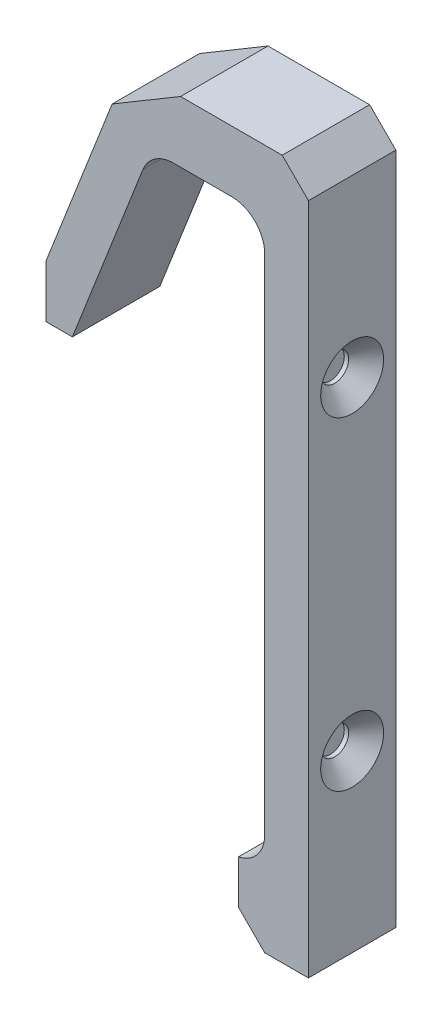
ISO-10303-21;
HEADER;
FILE_DESCRIPTION(('STEP AP214'),'2;1');
FILE_NAME('part.step','',(''),(''),'','','');
FILE_SCHEMA(('AUTOMOTIVE_DESIGN { 1 0 10303 214 1 1 1 1 }'));
ENDSEC;
DATA;
#1=APPLICATION_CONTEXT('core data for automotive mechanical design processes');
#2=APPLICATION_PROTOCOL_DEFINITION('international standard','automotive_design',2000,#1);
#3=PRODUCT_CONTEXT('',#1,'mechanical');
#4=PRODUCT('Part','Part','',(#3));
#5=PRODUCT_RELATED_PRODUCT_CATEGORY('part','',(#4));
#6=PRODUCT_DEFINITION_FORMATION('','',#4);
#7=PRODUCT_DEFINITION_CONTEXT('part definition',#1,'design');
#8=PRODUCT_DEFINITION('design','',#6,#7);
#9=PRODUCT_DEFINITION_SHAPE('','',#8);
#10=(LENGTH_UNIT() NAMED_UNIT(*) SI_UNIT(.MILLI.,.METRE.));
#11=(NAMED_UNIT(*) PLANE_ANGLE_UNIT() SI_UNIT($,.RADIAN.));
#12=(NAMED_UNIT(*) SI_UNIT($,.STERADIAN.) SOLID_ANGLE_UNIT());
#13=UNCERTAINTY_MEASURE_WITH_UNIT(LENGTH_MEASURE(1.E-05),#10,'distance_accuracy_value','');
#14=(GEOMETRIC_REPRESENTATION_CONTEXT(3) GLOBAL_UNCERTAINTY_ASSIGNED_CONTEXT((#13)) GLOBAL_UNIT_ASSIGNED_CONTEXT((#10,
#11,#12)) REPRESENTATION_CONTEXT('',''));
#15=CARTESIAN_POINT('',(0.,0.,0.));
#16=DIRECTION('',(0.,0.,1.));
#17=DIRECTION('',(1.,0.,0.));
#18=AXIS2_PLACEMENT_3D('',#15,#16,#17);
#19=CARTESIAN_POINT('',(0.,0.,25.4));
#20=DIRECTION('',(1.,0.,0.));
#21=DIRECTION('',(0.,0.,-1.));
#22=AXIS2_PLACEMENT_3D('',#19,#20,#21);
#23=PLANE('',#22);
#24=DIRECTION('',(0.,-1.,0.));
#25=VECTOR('',#24,1.);
#26=CARTESIAN_POINT('',(0.,0.,25.4));
#27=LINE('',#26,#25);
#28=CARTESIAN_POINT('',(0.,142.378540166089,25.4));
#29=VERTEX_POINT('',#28);
#30=CARTESIAN_POINT('',(0.,127.,25.4));
#31=VERTEX_POINT('',#30);
#32=EDGE_CURVE('E168',#29,#31,#27,.T.);
#33=ORIENTED_EDGE('',*,*,#32,.F.);
#34=DIRECTION('',(0.,0.,1.));
#35=VECTOR('',#34,1.);
#36=CARTESIAN_POINT('',(0.,142.378540166089,0.));
#37=LINE('',#36,#35);
#38=CARTESIAN_POINT('',(0.,142.378540166089,0.));
#39=VERTEX_POINT('',#38);
#40=EDGE_CURVE('E154',#39,#29,#37,.T.);
#41=ORIENTED_EDGE('',*,*,#40,.F.);
#42=DIRECTION('',(0.,-1.,0.));
#43=VECTOR('',#42,1.);
#44=CARTESIAN_POINT('',(0.,0.,0.));
#45=LINE('',#44,#43);
#46=CARTESIAN_POINT('',(0.,127.,0.));
#47=VERTEX_POINT('',#46);
#48=EDGE_CURVE('E166',#39,#47,#45,.T.);
#49=ORIENTED_EDGE('',*,*,#48,.T.);
#50=DIRECTION('',(0.,0.,1.));
#51=VECTOR('',#50,1.);
#52=CARTESIAN_POINT('',(0.,127.,0.));
#53=LINE('',#52,#51);
#54=EDGE_CURVE('E176',#47,#31,#53,.T.);
#55=ORIENTED_EDGE('',*,*,#54,.T.);
#56=EDGE_LOOP('',(#33,#41,#49,#55));
#57=FACE_BOUND('',#56,.T.);
#58=ADVANCED_FACE('F40',(#57),#23,.F.);
#59=CARTESIAN_POINT('',(0.,0.,25.4));
#60=DIRECTION('',(0.,1.,0.));
#61=DIRECTION('',(0.,0.,1.));
#62=AXIS2_PLACEMENT_3D('',#59,#60,#61);
#63=PLANE('',#62);
#64=DIRECTION('',(1.,0.,0.));
#65=VECTOR('',#64,1.);
#66=CARTESIAN_POINT('',(0.,0.,25.4));
#67=LINE('',#66,#65);
#68=CARTESIAN_POINT('',(63.5,0.,25.4));
#69=VERTEX_POINT('',#68);
#70=CARTESIAN_POINT('',(76.2,0.,25.4));
#71=VERTEX_POINT('',#70);
#72=EDGE_CURVE('E284',#69,#71,#67,.T.);
#73=ORIENTED_EDGE('',*,*,#72,.F.);
#74=DIRECTION('',(0.,0.,-1.));
#75=VECTOR('',#74,1.);
#76=CARTESIAN_POINT('',(63.5,0.,25.4));
#77=LINE('',#76,#75);
#78=CARTESIAN_POINT('',(63.5,0.,0.));
#79=VERTEX_POINT('',#78);
#80=EDGE_CURVE('E48',#69,#79,#77,.T.);
#81=ORIENTED_EDGE('',*,*,#80,.T.);
#82=DIRECTION('',(1.,0.,0.));
#83=VECTOR('',#82,1.);
#84=CARTESIAN_POINT('',(0.,0.,0.));
#85=LINE('',#84,#83);
#86=CARTESIAN_POINT('',(76.2,0.,0.));
#87=VERTEX_POINT('',#86);
#88=EDGE_CURVE('E175',#79,#87,#85,.T.);
#89=ORIENTED_EDGE('',*,*,#88,.T.);
#90=DIRECTION('',(0.,0.,-1.));
#91=VECTOR('',#90,1.);
#92=CARTESIAN_POINT('',(76.2,0.,25.4));
#93=LINE('',#92,#91);
#94=EDGE_CURVE('E191',#71,#87,#93,.T.);
#95=ORIENTED_EDGE('',*,*,#94,.F.);
#96=EDGE_LOOP('',(#73,#81,#89,#95));
#97=FACE_BOUND('',#96,.T.);
#98=ADVANCED_FACE('F303',(#97),#63,.F.);
#99=CARTESIAN_POINT('',(76.2,0.,25.4));
#100=DIRECTION('',(-1.,0.,0.));
#101=DIRECTION('',(0.,0.,1.));
#102=AXIS2_PLACEMENT_3D('',#99,#100,#101);
#103=PLANE('',#102);
#104=CARTESIAN_POINT('',(76.2,50.8,12.7));
#105=DIRECTION('',(-1.,0.,0.));
#106=DIRECTION('',(0.,0.,1.));
#107=AXIS2_PLACEMENT_3D('',#104,#105,#106);
#108=CIRCLE('',#107,9.14400000000001);
#109=CARTESIAN_POINT('',(76.2,50.8,21.844));
#110=VERTEX_POINT('',#109);
#111=EDGE_CURVE('E237',#110,#110,#108,.T.);
#112=ORIENTED_EDGE('',*,*,#111,.T.);
#113=EDGE_LOOP('',(#112));
#114=FACE_BOUND('',#113,.T.);
#115=CARTESIAN_POINT('',(76.2,144.78,12.7));
#116=DIRECTION('',(-1.,0.,0.));
#117=DIRECTION('',(0.,0.,1.));
#118=AXIS2_PLACEMENT_3D('',#115,#116,#117);
#119=CIRCLE('',#118,9.14400000000001);
#120=CARTESIAN_POINT('',(76.2,144.78,21.844));
#121=VERTEX_POINT('',#120);
#122=EDGE_CURVE('E234',#121,#121,#119,.T.);
#123=ORIENTED_EDGE('',*,*,#122,.T.);
#124=EDGE_LOOP('',(#123));
#125=FACE_BOUND('',#124,.T.);
#126=DIRECTION('',(0.,1.,0.));
#127=VECTOR('',#126,1.);
#128=CARTESIAN_POINT('',(76.2,0.,0.));
#129=LINE('',#128,#127);
#130=CARTESIAN_POINT('',(76.2,195.58,0.));
#131=VERTEX_POINT('',#130);
#132=EDGE_CURVE('E178',#87,#131,#129,.T.);
#133=ORIENTED_EDGE('',*,*,#132,.T.);
#134=DIRECTION('',(0.,0.,1.));
#135=VECTOR('',#134,1.);
#136=CARTESIAN_POINT('',(76.2,195.58,25.4));
#137=LINE('',#136,#135);
#138=CARTESIAN_POINT('',(76.2,195.58,25.4));
#139=VERTEX_POINT('',#138);
#140=EDGE_CURVE('E219',#131,#139,#137,.T.);
#141=ORIENTED_EDGE('',*,*,#140,.T.);
#142=DIRECTION('',(0.,1.,0.));
#143=VECTOR('',#142,1.);
#144=CARTESIAN_POINT('',(76.2,0.,25.4));
#145=LINE('',#144,#143);
#146=EDGE_CURVE('E285',#71,#139,#145,.T.);
#147=ORIENTED_EDGE('',*,*,#146,.F.);
#148=ORIENTED_EDGE('',*,*,#94,.T.);
#149=EDGE_LOOP('',(#133,#141,#147,#148));
#150=FACE_BOUND('',#149,.T.);
#151=ADVANCED_FACE('F301',(#114,#125,#150),#103,.F.);
#152=CARTESIAN_POINT('',(0.,203.2,25.4));
#153=DIRECTION('',(0.,-1.,0.));
#154=DIRECTION('',(0.,0.,-1.));
#155=AXIS2_PLACEMENT_3D('',#152,#153,#154);
#156=PLANE('',#155);
#157=DIRECTION('',(-1.,0.,0.));
#158=VECTOR('',#157,1.);
#159=CARTESIAN_POINT('',(0.,203.2,0.));
#160=LINE('',#159,#158);
#161=CARTESIAN_POINT('',(68.58,203.2,0.));
#162=VERTEX_POINT('',#161);
#163=CARTESIAN_POINT('',(39.039701674139,203.2,0.));
#164=VERTEX_POINT('',#163);
#165=EDGE_CURVE('E188',#162,#164,#160,.T.);
#166=ORIENTED_EDGE('',*,*,#165,.T.);
#167=DIRECTION('',(0.,0.,1.));
#168=VECTOR('',#167,1.);
#169=CARTESIAN_POINT('',(39.0397016741391,203.2,25.4));
#170=LINE('',#169,#168);
#171=CARTESIAN_POINT('',(39.039701674139,203.2,25.4));
#172=VERTEX_POINT('',#171);
#173=EDGE_CURVE('E223',#164,#172,#170,.T.);
#174=ORIENTED_EDGE('',*,*,#173,.T.);
#175=DIRECTION('',(-1.,0.,0.));
#176=VECTOR('',#175,1.);
#177=CARTESIAN_POINT('',(0.,203.2,25.4));
#178=LINE('',#177,#176);
#179=CARTESIAN_POINT('',(68.58,203.2,25.4));
#180=VERTEX_POINT('',#179);
#181=EDGE_CURVE('E183',#180,#172,#178,.T.);
#182=ORIENTED_EDGE('',*,*,#181,.F.);
#183=DIRECTION('',(0.,0.,-1.));
#184=VECTOR('',#183,1.);
#185=CARTESIAN_POINT('',(68.58,203.2,25.4));
#186=LINE('',#185,#184);
#187=EDGE_CURVE('E214',#180,#162,#186,.T.);
#188=ORIENTED_EDGE('',*,*,#187,.T.);
#189=EDGE_LOOP('',(#166,#174,#182,#188));
#190=FACE_BOUND('',#189,.T.);
#191=ADVANCED_FACE('F293',(#190),#156,.F.);
#192=CARTESIAN_POINT('',(0.,0.,25.4));
#193=DIRECTION('',(0.,0.,-1.));
#194=DIRECTION('',(-1.,0.,0.));
#195=AXIS2_PLACEMENT_3D('',#192,#193,#194);
#196=PLANE('',#195);
#197=DIRECTION('',(0.,1.,0.));
#198=VECTOR('',#197,1.);
#199=CARTESIAN_POINT('',(55.88,0.,25.4));
#200=LINE('',#199,#198);
#201=CARTESIAN_POINT('',(55.88,7.61999999999999,25.4));
#202=VERTEX_POINT('',#201);
#203=CARTESIAN_POINT('',(55.88,20.32,25.4));
#204=VERTEX_POINT('',#203);
#205=EDGE_CURVE('E169',#202,#204,#200,.T.);
#206=ORIENTED_EDGE('',*,*,#205,.F.);
#207=DIRECTION('',(-0.707106781186549,0.707106781186546,0.));
#208=VECTOR('',#207,1.);
#209=CARTESIAN_POINT('',(55.88,7.61999999999999,25.4));
#210=LINE('',#209,#208);
#211=EDGE_CURVE('E62',#202,#69,#210,.F.);
#212=ORIENTED_EDGE('',*,*,#211,.T.);
#213=ORIENTED_EDGE('',*,*,#72,.T.);
#214=ORIENTED_EDGE('',*,*,#146,.T.);
#215=DIRECTION('',(0.707106781186546,-0.707106781186549,0.));
#216=VECTOR('',#215,1.);
#217=CARTESIAN_POINT('',(68.58,203.2,25.4));
#218=LINE('',#217,#216);
#219=EDGE_CURVE('E221',#139,#180,#218,.F.);
#220=ORIENTED_EDGE('',*,*,#219,.T.);
#221=ORIENTED_EDGE('',*,*,#181,.T.);
#222=DIRECTION('',(0.859280163797692,0.511505229791262,0.));
#223=VECTOR('',#222,1.);
#224=CARTESIAN_POINT('',(39.0397016741391,203.2,25.4));
#225=LINE('',#224,#223);
#226=CARTESIAN_POINT('',(19.1718299471665,191.373216697737,25.4));
#227=VERTEX_POINT('',#226);
#228=EDGE_CURVE('E226',#172,#227,#225,.F.);
#229=ORIENTED_EDGE('',*,*,#228,.T.);
#230=DIRECTION('',(0.364399348580512,0.931242779705754,0.));
#231=VECTOR('',#230,1.);
#232=CARTESIAN_POINT('',(0.,142.378540166089,25.4));
#233=LINE('',#232,#231);
#234=EDGE_CURVE('E161',#29,#227,#233,.T.);
#235=ORIENTED_EDGE('',*,*,#234,.F.);
#236=ORIENTED_EDGE('',*,*,#32,.T.);
#237=DIRECTION('',(-1.,0.,0.));
#238=VECTOR('',#237,1.);
#239=CARTESIAN_POINT('',(0.,127.,25.4));
#240=LINE('',#239,#238);
#241=CARTESIAN_POINT('',(7.61999999999999,127.,25.4));
#242=VERTEX_POINT('',#241);
#243=EDGE_CURVE('E276',#242,#31,#240,.T.);
#244=ORIENTED_EDGE('',*,*,#243,.F.);
#245=DIRECTION('',(-0.364399348580512,-0.931242779705753,0.));
#246=VECTOR('',#245,1.);
#247=CARTESIAN_POINT('',(7.61999999999999,127.,25.4));
#248=LINE('',#247,#246);
#249=CARTESIAN_POINT('',(28.1110058329158,179.365903795229,25.4));
#250=VERTEX_POINT('',#249);
#251=EDGE_CURVE('E274',#250,#242,#248,.T.);
#252=ORIENTED_EDGE('',*,*,#251,.F.);
#253=CARTESIAN_POINT('',(36.9810933096132,175.895,25.4));
#254=DIRECTION('',(0.,0.,-1.));
#255=DIRECTION('',(-1.,0.,0.));
#256=AXIS2_PLACEMENT_3D('',#253,#254,#255);
#257=CIRCLE('',#256,9.525);
#258=CARTESIAN_POINT('',(36.9810933096132,185.42,25.4));
#259=VERTEX_POINT('',#258);
#260=EDGE_CURVE('E205',#250,#259,#257,.T.);
#261=ORIENTED_EDGE('',*,*,#260,.T.);
#262=DIRECTION('',(-1.,0.,0.));
#263=VECTOR('',#262,1.);
#264=CARTESIAN_POINT('',(63.5,185.42,25.4));
#265=LINE('',#264,#263);
#266=CARTESIAN_POINT('',(53.975,185.42,25.4));
#267=VERTEX_POINT('',#266);
#268=EDGE_CURVE('E267',#267,#259,#265,.T.);
#269=ORIENTED_EDGE('',*,*,#268,.F.);
#270=CARTESIAN_POINT('',(53.975,175.895,25.4));
#271=DIRECTION('',(0.,0.,-1.));
#272=DIRECTION('',(-1.,0.,0.));
#273=AXIS2_PLACEMENT_3D('',#270,#271,#272);
#274=CIRCLE('',#273,9.525);
#275=CARTESIAN_POINT('',(63.5,175.895,25.4));
#276=VERTEX_POINT('',#275);
#277=EDGE_CURVE('E209',#267,#276,#274,.T.);
#278=ORIENTED_EDGE('',*,*,#277,.T.);
#279=DIRECTION('',(0.,1.,0.));
#280=VECTOR('',#279,1.);
#281=CARTESIAN_POINT('',(63.5,20.32,25.4));
#282=LINE('',#281,#280);
#283=CARTESIAN_POINT('',(63.5,29.6525559200039,25.4));
#284=VERTEX_POINT('',#283);
#285=EDGE_CURVE('E265',#284,#276,#282,.T.);
#286=ORIENTED_EDGE('',*,*,#285,.F.);
#287=CARTESIAN_POINT('',(53.975,29.6525559200039,25.4));
#288=DIRECTION('',(0.,0.,-1.));
#289=DIRECTION('',(-1.,0.,0.));
#290=AXIS2_PLACEMENT_3D('',#287,#288,#289);
#291=CIRCLE('',#290,9.525);
#292=EDGE_CURVE('E246',#284,#204,#291,.T.);
#293=ORIENTED_EDGE('',*,*,#292,.T.);
#294=EDGE_LOOP('',(#206,#212,#213,#214,#220,#221,#229,#235,#236,#244,#252,#261,#269,#278,#286,#293));
#295=FACE_BOUND('',#294,.T.);
#296=ADVANCED_FACE('F262',(#295),#196,.F.);
#297=CARTESIAN_POINT('',(0.,0.,0.));
#298=DIRECTION('',(0.,0.,-1.));
#299=DIRECTION('',(-1.,0.,0.));
#300=AXIS2_PLACEMENT_3D('',#297,#298,#299);
#301=PLANE('',#300);
#302=ORIENTED_EDGE('',*,*,#88,.F.);
#303=DIRECTION('',(0.707106781186549,-0.707106781186546,0.));
#304=VECTOR('',#303,1.);
#305=CARTESIAN_POINT('',(31.7499999999999,31.75,0.));
#306=LINE('',#305,#304);
#307=CARTESIAN_POINT('',(55.88,7.61999999999999,0.));
#308=VERTEX_POINT('',#307);
#309=EDGE_CURVE('E11',#79,#308,#306,.F.);
#310=ORIENTED_EDGE('',*,*,#309,.T.);
#311=DIRECTION('',(0.,1.,0.));
#312=VECTOR('',#311,1.);
#313=CARTESIAN_POINT('',(55.88,0.,0.));
#314=LINE('',#313,#312);
#315=CARTESIAN_POINT('',(55.88,20.32,0.));
#316=VERTEX_POINT('',#315);
#317=EDGE_CURVE('E259',#308,#316,#314,.T.);
#318=ORIENTED_EDGE('',*,*,#317,.T.);
#319=CARTESIAN_POINT('',(53.975,29.6525559200039,0.));
#320=DIRECTION('',(0.,0.,-1.));
#321=DIRECTION('',(-1.,0.,0.));
#322=AXIS2_PLACEMENT_3D('',#319,#320,#321);
#323=CIRCLE('',#322,9.525);
#324=CARTESIAN_POINT('',(63.5,29.6525559200039,0.));
#325=VERTEX_POINT('',#324);
#326=EDGE_CURVE('E249',#316,#325,#323,.F.);
#327=ORIENTED_EDGE('',*,*,#326,.T.);
#328=DIRECTION('',(0.,1.,0.));
#329=VECTOR('',#328,1.);
#330=CARTESIAN_POINT('',(63.5,20.32,0.));
#331=LINE('',#330,#329);
#332=CARTESIAN_POINT('',(63.5,175.895,0.));
#333=VERTEX_POINT('',#332);
#334=EDGE_CURVE('E362',#325,#333,#331,.T.);
#335=ORIENTED_EDGE('',*,*,#334,.T.);
#336=CARTESIAN_POINT('',(53.975,175.895,0.));
#337=DIRECTION('',(0.,0.,-1.));
#338=DIRECTION('',(-1.,0.,0.));
#339=AXIS2_PLACEMENT_3D('',#336,#337,#338);
#340=CIRCLE('',#339,9.525);
#341=CARTESIAN_POINT('',(53.975,185.42,0.));
#342=VERTEX_POINT('',#341);
#343=EDGE_CURVE('E212',#333,#342,#340,.F.);
#344=ORIENTED_EDGE('',*,*,#343,.T.);
#345=DIRECTION('',(-1.,0.,0.));
#346=VECTOR('',#345,1.);
#347=CARTESIAN_POINT('',(63.5,185.42,0.));
#348=LINE('',#347,#346);
#349=CARTESIAN_POINT('',(36.9810933096132,185.42,0.));
#350=VERTEX_POINT('',#349);
#351=EDGE_CURVE('E364',#342,#350,#348,.T.);
#352=ORIENTED_EDGE('',*,*,#351,.T.);
#353=CARTESIAN_POINT('',(36.9810933096132,175.895,0.));
#354=DIRECTION('',(0.,0.,-1.));
#355=DIRECTION('',(-1.,0.,0.));
#356=AXIS2_PLACEMENT_3D('',#353,#354,#355);
#357=CIRCLE('',#356,9.525);
#358=CARTESIAN_POINT('',(28.1110058329158,179.365903795229,0.));
#359=VERTEX_POINT('',#358);
#360=EDGE_CURVE('E207',#350,#359,#357,.F.);
#361=ORIENTED_EDGE('',*,*,#360,.T.);
#362=DIRECTION('',(-0.364399348580512,-0.931242779705753,0.));
#363=VECTOR('',#362,1.);
#364=CARTESIAN_POINT('',(7.61999999999999,127.,0.));
#365=LINE('',#364,#363);
#366=CARTESIAN_POINT('',(7.61999999999999,127.,0.));
#367=VERTEX_POINT('',#366);
#368=EDGE_CURVE('E366',#359,#367,#365,.T.);
#369=ORIENTED_EDGE('',*,*,#368,.T.);
#370=DIRECTION('',(-1.,0.,0.));
#371=VECTOR('',#370,1.);
#372=CARTESIAN_POINT('',(0.,127.,0.));
#373=LINE('',#372,#371);
#374=EDGE_CURVE('E174',#367,#47,#373,.T.);
#375=ORIENTED_EDGE('',*,*,#374,.T.);
#376=ORIENTED_EDGE('',*,*,#48,.F.);
#377=DIRECTION('',(0.364399348580512,0.931242779705754,0.));
#378=VECTOR('',#377,1.);
#379=CARTESIAN_POINT('',(0.,142.378540166089,0.));
#380=LINE('',#379,#378);
#381=CARTESIAN_POINT('',(19.1718299471665,191.373216697737,0.));
#382=VERTEX_POINT('',#381);
#383=EDGE_CURVE('E150',#39,#382,#380,.T.);
#384=ORIENTED_EDGE('',*,*,#383,.T.);
#385=DIRECTION('',(-0.859280163797692,-0.511505229791262,0.));
#386=VECTOR('',#385,1.);
#387=CARTESIAN_POINT('',(-79.0974898253348,132.876264121163,0.));
#388=LINE('',#387,#386);
#389=EDGE_CURVE('E229',#382,#164,#388,.F.);
#390=ORIENTED_EDGE('',*,*,#389,.T.);
#391=ORIENTED_EDGE('',*,*,#165,.F.);
#392=DIRECTION('',(-0.707106781186546,0.707106781186549,0.));
#393=VECTOR('',#392,1.);
#394=CARTESIAN_POINT('',(135.89,135.89,0.));
#395=LINE('',#394,#393);
#396=EDGE_CURVE('E217',#162,#131,#395,.F.);
#397=ORIENTED_EDGE('',*,*,#396,.T.);
#398=ORIENTED_EDGE('',*,*,#132,.F.);
#399=EDGE_LOOP('',(#302,#310,#318,#327,#335,#344,#352,#361,#369,#375,#376,#384,#390,#391,#397,#398));
#400=FACE_BOUND('',#399,.T.);
#401=ADVANCED_FACE('F172',(#400),#301,.T.);
#402=CARTESIAN_POINT('',(0.,127.,0.));
#403=DIRECTION('',(0.,1.,0.));
#404=DIRECTION('',(0.,0.,1.));
#405=AXIS2_PLACEMENT_3D('',#402,#403,#404);
#406=PLANE('',#405);
#407=ORIENTED_EDGE('',*,*,#243,.T.);
#408=ORIENTED_EDGE('',*,*,#54,.F.);
#409=ORIENTED_EDGE('',*,*,#374,.F.);
#410=DIRECTION('',(0.,0.,1.));
#411=VECTOR('',#410,1.);
#412=CARTESIAN_POINT('',(7.61999999999999,127.,0.));
#413=LINE('',#412,#411);
#414=EDGE_CURVE('E180',#367,#242,#413,.T.);
#415=ORIENTED_EDGE('',*,*,#414,.T.);
#416=EDGE_LOOP('',(#407,#408,#409,#415));
#417=FACE_BOUND('',#416,.T.);
#418=ADVANCED_FACE('F376',(#417),#406,.F.);
#419=CARTESIAN_POINT('',(7.61999999999999,127.,0.));
#420=DIRECTION('',(-0.931242779705753,0.364399348580512,0.));
#421=DIRECTION('',(-0.364399348580512,-0.931242779705753,0.));
#422=AXIS2_PLACEMENT_3D('',#419,#420,#421);
#423=PLANE('',#422);
#424=ORIENTED_EDGE('',*,*,#368,.F.);
#425=DIRECTION('',(0.,0.,1.));
#426=VECTOR('',#425,1.);
#427=CARTESIAN_POINT('',(28.1110058329158,179.365903795229,25.4));
#428=LINE('',#427,#426);
#429=EDGE_CURVE('E194',#359,#250,#428,.T.);
#430=ORIENTED_EDGE('',*,*,#429,.T.);
#431=ORIENTED_EDGE('',*,*,#251,.T.);
#432=ORIENTED_EDGE('',*,*,#414,.F.);
#433=EDGE_LOOP('',(#424,#430,#431,#432));
#434=FACE_BOUND('',#433,.T.);
#435=ADVANCED_FACE('F372',(#434),#423,.F.);
#436=CARTESIAN_POINT('',(63.5,185.42,0.));
#437=DIRECTION('',(0.,1.,0.));
#438=DIRECTION('',(-1.,0.,0.));
#439=AXIS2_PLACEMENT_3D('',#436,#437,#438);
#440=PLANE('',#439);
#441=ORIENTED_EDGE('',*,*,#268,.T.);
#442=DIRECTION('',(0.,0.,1.));
#443=VECTOR('',#442,1.);
#444=CARTESIAN_POINT('',(36.9810933096132,185.42,0.));
#445=LINE('',#444,#443);
#446=EDGE_CURVE('E200',#259,#350,#445,.F.);
#447=ORIENTED_EDGE('',*,*,#446,.T.);
#448=ORIENTED_EDGE('',*,*,#351,.F.);
#449=DIRECTION('',(0.,0.,1.));
#450=VECTOR('',#449,1.);
#451=CARTESIAN_POINT('',(53.975,185.42,25.4));
#452=LINE('',#451,#450);
#453=EDGE_CURVE('E197',#342,#267,#452,.T.);
#454=ORIENTED_EDGE('',*,*,#453,.T.);
#455=EDGE_LOOP('',(#441,#447,#448,#454));
#456=FACE_BOUND('',#455,.T.);
#457=ADVANCED_FACE('F380',(#456),#440,.F.);
#458=CARTESIAN_POINT('',(63.5,20.32,0.));
#459=DIRECTION('',(1.,0.,0.));
#460=DIRECTION('',(0.,0.,-1.));
#461=AXIS2_PLACEMENT_3D('',#458,#459,#460);
#462=PLANE('',#461);
#463=ORIENTED_EDGE('',*,*,#334,.F.);
#464=DIRECTION('',(0.,0.,1.));
#465=VECTOR('',#464,1.);
#466=CARTESIAN_POINT('',(63.5,29.6525559200039,0.));
#467=LINE('',#466,#465);
#468=EDGE_CURVE('E243',#325,#284,#467,.T.);
#469=ORIENTED_EDGE('',*,*,#468,.T.);
#470=ORIENTED_EDGE('',*,*,#285,.T.);
#471=DIRECTION('',(0.,0.,1.));
#472=VECTOR('',#471,1.);
#473=CARTESIAN_POINT('',(63.5,175.895,0.));
#474=LINE('',#473,#472);
#475=EDGE_CURVE('E202',#276,#333,#474,.F.);
#476=ORIENTED_EDGE('',*,*,#475,.T.);
#477=EDGE_LOOP('',(#463,#469,#470,#476));
#478=FACE_BOUND('',#477,.T.);
#479=ADVANCED_FACE('F387',(#478),#462,.F.);
#480=CARTESIAN_POINT('',(55.88,0.,0.));
#481=DIRECTION('',(1.,0.,0.));
#482=DIRECTION('',(0.,0.,-1.));
#483=AXIS2_PLACEMENT_3D('',#480,#481,#482);
#484=PLANE('',#483);
#485=ORIENTED_EDGE('',*,*,#317,.F.);
#486=DIRECTION('',(0.,0.,1.));
#487=VECTOR('',#486,1.);
#488=CARTESIAN_POINT('',(55.88,7.61999999999999,0.));
#489=LINE('',#488,#487);
#490=EDGE_CURVE('E251',#308,#202,#489,.T.);
#491=ORIENTED_EDGE('',*,*,#490,.T.);
#492=ORIENTED_EDGE('',*,*,#205,.T.);
#493=DIRECTION('',(0.,0.,1.));
#494=VECTOR('',#493,1.);
#495=CARTESIAN_POINT('',(55.88,20.32,0.));
#496=LINE('',#495,#494);
#497=EDGE_CURVE('E281',#316,#204,#496,.T.);
#498=ORIENTED_EDGE('',*,*,#497,.F.);
#499=EDGE_LOOP('',(#485,#491,#492,#498));
#500=FACE_BOUND('',#499,.T.);
#501=ADVANCED_FACE('F257',(#500),#484,.F.);
#502=CARTESIAN_POINT('',(0.,142.378540166089,0.));
#503=DIRECTION('',(0.931242779705754,-0.364399348580512,0.));
#504=DIRECTION('',(0.364399348580512,0.931242779705754,0.));
#505=AXIS2_PLACEMENT_3D('',#502,#503,#504);
#506=PLANE('',#505);
#507=ORIENTED_EDGE('',*,*,#234,.T.);
#508=DIRECTION('',(0.,0.,-1.));
#509=VECTOR('',#508,1.);
#510=CARTESIAN_POINT('',(19.1718299471665,191.373216697737,0.));
#511=LINE('',#510,#509);
#512=EDGE_CURVE('E157',#227,#382,#511,.T.);
#513=ORIENTED_EDGE('',*,*,#512,.T.);
#514=ORIENTED_EDGE('',*,*,#383,.F.);
#515=ORIENTED_EDGE('',*,*,#40,.T.);
#516=EDGE_LOOP('',(#507,#513,#514,#515));
#517=FACE_BOUND('',#516,.T.);
#518=ADVANCED_FACE('F153',(#517),#506,.F.);
#519=CARTESIAN_POINT('',(36.9810933096132,175.895,0.));
#520=DIRECTION('',(0.,0.,-1.));
#521=DIRECTION('',(-1.,0.,0.));
#522=AXIS2_PLACEMENT_3D('',#519,#520,#521);
#523=CYLINDRICAL_SURFACE('',#522,9.525);
#524=ORIENTED_EDGE('',*,*,#360,.F.);
#525=ORIENTED_EDGE('',*,*,#446,.F.);
#526=ORIENTED_EDGE('',*,*,#260,.F.);
#527=ORIENTED_EDGE('',*,*,#429,.F.);
#528=EDGE_LOOP('',(#524,#525,#526,#527));
#529=FACE_BOUND('',#528,.T.);
#530=ADVANCED_FACE('F319',(#529),#523,.F.);
#531=CARTESIAN_POINT('',(53.975,175.895,0.));
#532=DIRECTION('',(0.,0.,-1.));
#533=DIRECTION('',(-1.,0.,0.));
#534=AXIS2_PLACEMENT_3D('',#531,#532,#533);
#535=CYLINDRICAL_SURFACE('',#534,9.525);
#536=ORIENTED_EDGE('',*,*,#343,.F.);
#537=ORIENTED_EDGE('',*,*,#475,.F.);
#538=ORIENTED_EDGE('',*,*,#277,.F.);
#539=ORIENTED_EDGE('',*,*,#453,.F.);
#540=EDGE_LOOP('',(#536,#537,#538,#539));
#541=FACE_BOUND('',#540,.T.);
#542=ADVANCED_FACE('F322',(#541),#535,.F.);
#543=CARTESIAN_POINT('',(68.58,203.2,25.4));
#544=DIRECTION('',(-0.707106781186549,-0.707106781186546,0.));
#545=DIRECTION('',(0.,0.,-1.));
#546=AXIS2_PLACEMENT_3D('',#543,#544,#545);
#547=PLANE('',#546);
#548=ORIENTED_EDGE('',*,*,#219,.F.);
#549=ORIENTED_EDGE('',*,*,#140,.F.);
#550=ORIENTED_EDGE('',*,*,#396,.F.);
#551=ORIENTED_EDGE('',*,*,#187,.F.);
#552=EDGE_LOOP('',(#548,#549,#550,#551));
#553=FACE_BOUND('',#552,.T.);
#554=ADVANCED_FACE('F297',(#553),#547,.F.);
#555=CARTESIAN_POINT('',(39.0397016741391,203.2,25.4));
#556=DIRECTION('',(0.511505229791262,-0.859280163797692,0.));
#557=DIRECTION('',(0.,0.,1.));
#558=AXIS2_PLACEMENT_3D('',#555,#556,#557);
#559=PLANE('',#558);
#560=ORIENTED_EDGE('',*,*,#389,.F.);
#561=ORIENTED_EDGE('',*,*,#512,.F.);
#562=ORIENTED_EDGE('',*,*,#228,.F.);
#563=ORIENTED_EDGE('',*,*,#173,.F.);
#564=EDGE_LOOP('',(#560,#561,#562,#563));
#565=FACE_BOUND('',#564,.T.);
#566=ADVANCED_FACE('F329',(#565),#559,.F.);
#567=CARTESIAN_POINT('',(69.85,144.78,12.7));
#568=DIRECTION('',(1.,0.,0.));
#569=DIRECTION('',(0.,0.,-1.));
#570=AXIS2_PLACEMENT_3D('',#567,#568,#569);
#571=CYLINDRICAL_SURFACE('',#570,4.064);
#572=CARTESIAN_POINT('',(71.12,144.78,12.7));
#573=DIRECTION('',(-1.,0.,0.));
#574=DIRECTION('',(0.,0.,1.));
#575=AXIS2_PLACEMENT_3D('',#572,#573,#574);
#576=CIRCLE('',#575,4.064);
#577=CARTESIAN_POINT('',(71.12,144.78,16.764));
#578=VERTEX_POINT('',#577);
#579=EDGE_CURVE('E240',#578,#578,#576,.F.);
#580=ORIENTED_EDGE('',*,*,#579,.T.);
#581=EDGE_LOOP('',(#580));
#582=FACE_BOUND('',#581,.T.);
#583=CARTESIAN_POINT('',(69.85,144.78,12.7));
#584=DIRECTION('',(1.,0.,0.));
#585=DIRECTION('',(0.,0.,-1.));
#586=AXIS2_PLACEMENT_3D('',#583,#584,#585);
#587=CIRCLE('',#586,4.064);
#588=CARTESIAN_POINT('',(69.85,144.78,8.63599999999999));
#589=VERTEX_POINT('',#588);
#590=EDGE_CURVE('E353',#589,#589,#587,.T.);
#591=ORIENTED_EDGE('',*,*,#590,.F.);
#592=EDGE_LOOP('',(#591));
#593=FACE_BOUND('',#592,.T.);
#594=ADVANCED_FACE('F332',(#582,#593),#571,.F.);
#595=CARTESIAN_POINT('',(69.85,144.78,12.7));
#596=DIRECTION('',(1.,0.,0.));
#597=DIRECTION('',(0.,0.,-1.));
#598=AXIS2_PLACEMENT_3D('',#595,#596,#597);
#599=PLANE('',#598);
#600=ORIENTED_EDGE('',*,*,#590,.T.);
#601=EDGE_LOOP('',(#600));
#602=FACE_BOUND('',#601,.T.);
#603=ADVANCED_FACE('F349',(#602),#599,.T.);
#604=CARTESIAN_POINT('',(69.85,50.8,12.7));
#605=DIRECTION('',(1.,0.,0.));
#606=DIRECTION('',(0.,0.,-1.));
#607=AXIS2_PLACEMENT_3D('',#604,#605,#606);
#608=CYLINDRICAL_SURFACE('',#607,4.064);
#609=CARTESIAN_POINT('',(71.12,50.8,12.7));
#610=DIRECTION('',(-1.,0.,0.));
#611=DIRECTION('',(0.,0.,1.));
#612=AXIS2_PLACEMENT_3D('',#609,#610,#611);
#613=CIRCLE('',#612,4.064);
#614=CARTESIAN_POINT('',(71.12,50.8,16.764));
#615=VERTEX_POINT('',#614);
#616=EDGE_CURVE('E231',#615,#615,#613,.F.);
#617=ORIENTED_EDGE('',*,*,#616,.T.);
#618=EDGE_LOOP('',(#617));
#619=FACE_BOUND('',#618,.T.);
#620=CARTESIAN_POINT('',(69.85,50.8,12.7));
#621=DIRECTION('',(1.,0.,0.));
#622=DIRECTION('',(0.,0.,-1.));
#623=AXIS2_PLACEMENT_3D('',#620,#621,#622);
#624=CIRCLE('',#623,4.064);
#625=CARTESIAN_POINT('',(69.85,50.8,8.63599999999998));
#626=VERTEX_POINT('',#625);
#627=EDGE_CURVE('E355',#626,#626,#624,.T.);
#628=ORIENTED_EDGE('',*,*,#627,.F.);
#629=EDGE_LOOP('',(#628));
#630=FACE_BOUND('',#629,.T.);
#631=ADVANCED_FACE('F414',(#619,#630),#608,.F.);
#632=CARTESIAN_POINT('',(69.85,50.8,12.7));
#633=DIRECTION('',(1.,0.,0.));
#634=DIRECTION('',(0.,0.,-1.));
#635=AXIS2_PLACEMENT_3D('',#632,#633,#634);
#636=PLANE('',#635);
#637=ORIENTED_EDGE('',*,*,#627,.T.);
#638=EDGE_LOOP('',(#637));
#639=FACE_BOUND('',#638,.T.);
#640=ADVANCED_FACE('F337',(#639),#636,.T.);
#641=CARTESIAN_POINT('',(71.12,50.8,12.7));
#642=DIRECTION('',(1.,0.,0.));
#643=DIRECTION('',(0.,0.,-1.));
#644=AXIS2_PLACEMENT_3D('',#641,#642,#643);
#645=CONICAL_SURFACE('',#644,4.064,0.78539816339745);
#646=ORIENTED_EDGE('',*,*,#111,.F.);
#647=EDGE_LOOP('',(#646));
#648=FACE_BOUND('',#647,.T.);
#649=ORIENTED_EDGE('',*,*,#616,.F.);
#650=EDGE_LOOP('',(#649));
#651=FACE_BOUND('',#650,.T.);
#652=ADVANCED_FACE('F334',(#648,#651),#645,.F.);
#653=CARTESIAN_POINT('',(71.12,144.78,12.7));
#654=DIRECTION('',(1.,0.,0.));
#655=DIRECTION('',(0.,0.,-1.));
#656=AXIS2_PLACEMENT_3D('',#653,#654,#655);
#657=CONICAL_SURFACE('',#656,4.064,0.78539816339745);
#658=ORIENTED_EDGE('',*,*,#122,.F.);
#659=EDGE_LOOP('',(#658));
#660=FACE_BOUND('',#659,.T.);
#661=ORIENTED_EDGE('',*,*,#579,.F.);
#662=EDGE_LOOP('',(#661));
#663=FACE_BOUND('',#662,.T.);
#664=ADVANCED_FACE('F309',(#660,#663),#657,.F.);
#665=CARTESIAN_POINT('',(53.975,29.6525559200039,0.));
#666=DIRECTION('',(0.,0.,1.));
#667=DIRECTION('',(1.,0.,0.));
#668=AXIS2_PLACEMENT_3D('',#665,#666,#667);
#669=CYLINDRICAL_SURFACE('',#668,9.525);
#670=ORIENTED_EDGE('',*,*,#326,.F.);
#671=ORIENTED_EDGE('',*,*,#497,.T.);
#672=ORIENTED_EDGE('',*,*,#292,.F.);
#673=ORIENTED_EDGE('',*,*,#468,.F.);
#674=EDGE_LOOP('',(#670,#671,#672,#673));
#675=FACE_BOUND('',#674,.T.);
#676=ADVANCED_FACE('F305',(#675),#669,.F.);
#677=CARTESIAN_POINT('',(55.88,7.61999999999999,0.));
#678=DIRECTION('',(0.707106781186546,0.707106781186549,0.));
#679=DIRECTION('',(0.,0.,1.));
#680=AXIS2_PLACEMENT_3D('',#677,#678,#679);
#681=PLANE('',#680);
#682=ORIENTED_EDGE('',*,*,#309,.F.);
#683=ORIENTED_EDGE('',*,*,#80,.F.);
#684=ORIENTED_EDGE('',*,*,#211,.F.);
#685=ORIENTED_EDGE('',*,*,#490,.F.);
#686=EDGE_LOOP('',(#682,#683,#684,#685));
#687=FACE_BOUND('',#686,.T.);
#688=ADVANCED_FACE('F42',(#687),#681,.F.);
#689=CLOSED_SHELL('',(#58,#98,#151,#191,#296,#401,#418,#435,#457,#479,#501,#518,#530,#542,#554,
#566,#594,#603,#631,#640,#652,#664,#676,#688));
#690=MANIFOLD_SOLID_BREP('B2',#689);
#691=ADVANCED_BREP_SHAPE_REPRESENTATION('',(#18,#690),#14);
#692=SHAPE_DEFINITION_REPRESENTATION(#9,#691);
ENDSEC;
END-ISO-10303-21;
